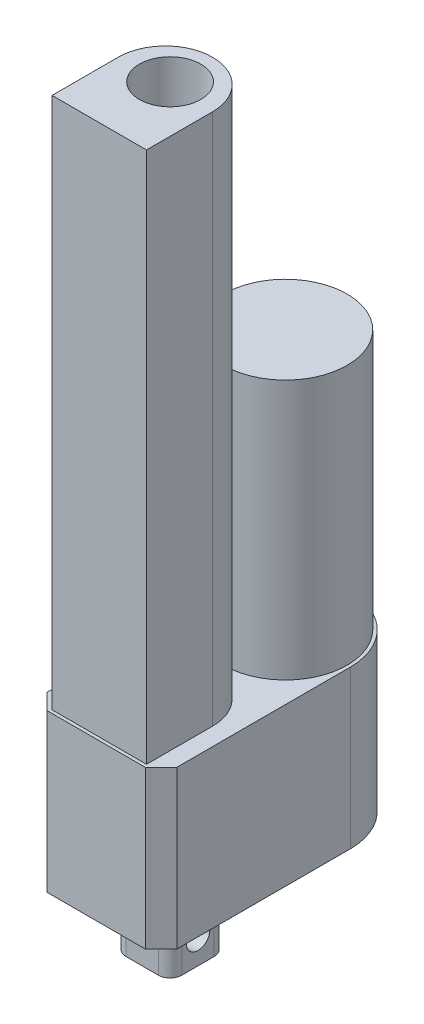
ISO-10303-21;
HEADER;
FILE_DESCRIPTION(('STEP AP214'),'2;1');
FILE_NAME('part.step','',(''),(''),'','','');
FILE_SCHEMA(('AUTOMOTIVE_DESIGN { 1 0 10303 214 1 1 1 1 }'));
ENDSEC;
DATA;
#1=APPLICATION_CONTEXT('core data for automotive mechanical design processes');
#2=APPLICATION_PROTOCOL_DEFINITION('international standard','automotive_design',2000,#1);
#3=PRODUCT_CONTEXT('',#1,'mechanical');
#4=PRODUCT('Part','Part','',(#3));
#5=PRODUCT_RELATED_PRODUCT_CATEGORY('part','',(#4));
#6=PRODUCT_DEFINITION_FORMATION('','',#4);
#7=PRODUCT_DEFINITION_CONTEXT('part definition',#1,'design');
#8=PRODUCT_DEFINITION('design','',#6,#7);
#9=PRODUCT_DEFINITION_SHAPE('','',#8);
#10=(LENGTH_UNIT() NAMED_UNIT(*) SI_UNIT(.MILLI.,.METRE.));
#11=(NAMED_UNIT(*) PLANE_ANGLE_UNIT() SI_UNIT($,.RADIAN.));
#12=(NAMED_UNIT(*) SI_UNIT($,.STERADIAN.) SOLID_ANGLE_UNIT());
#13=UNCERTAINTY_MEASURE_WITH_UNIT(LENGTH_MEASURE(1.E-05),#10,'distance_accuracy_value','');
#14=(GEOMETRIC_REPRESENTATION_CONTEXT(3) GLOBAL_UNCERTAINTY_ASSIGNED_CONTEXT((#13)) GLOBAL_UNIT_ASSIGNED_CONTEXT((#10,
#11,#12)) REPRESENTATION_CONTEXT('',''));
#15=CARTESIAN_POINT('',(0.,0.,0.));
#16=DIRECTION('',(0.,0.,1.));
#17=DIRECTION('',(1.,0.,0.));
#18=AXIS2_PLACEMENT_3D('',#15,#16,#17);
#19=CARTESIAN_POINT('',(-29.9066354603378,0.,-28.37671645601));
#20=DIRECTION('',(0.,1.,0.));
#21=DIRECTION('',(0.,0.,1.));
#22=AXIS2_PLACEMENT_3D('',#19,#20,#21);
#23=PLANE('',#22);
#24=CARTESIAN_POINT('',(-29.9066354603378,0.,-28.37671645601));
#25=DIRECTION('',(0.,1.,0.));
#26=DIRECTION('',(0.,0.,1.));
#27=AXIS2_PLACEMENT_3D('',#24,#25,#26);
#28=CIRCLE('',#27,20.9296);
#29=CARTESIAN_POINT('',(-29.9066354603376,0.,-49.30631645601));
#30=VERTEX_POINT('',#29);
#31=CARTESIAN_POINT('',(-50.8362354603378,0.,-28.3767164560098));
#32=VERTEX_POINT('',#31);
#33=EDGE_CURVE('E228',#30,#32,#28,.T.);
#34=ORIENTED_EDGE('',*,*,#33,.F.);
#35=DIRECTION('',(-1.,0.,0.));
#36=VECTOR('',#35,1.);
#37=CARTESIAN_POINT('',(-29.9066354603376,0.,-49.30631645601));
#38=LINE('',#37,#36);
#39=CARTESIAN_POINT('',(-29.8558354603379,0.,-49.30631645601));
#40=VERTEX_POINT('',#39);
#41=EDGE_CURVE('E235',#40,#30,#38,.T.);
#42=ORIENTED_EDGE('',*,*,#41,.F.);
#43=CARTESIAN_POINT('',(-29.8558354603378,0.,-28.37671645601));
#44=DIRECTION('',(0.,1.,0.));
#45=DIRECTION('',(0.,0.,-1.));
#46=AXIS2_PLACEMENT_3D('',#43,#44,#45);
#47=CIRCLE('',#46,20.9296);
#48=CARTESIAN_POINT('',(-8.92623546033779,0.,-28.3767164560098));
#49=VERTEX_POINT('',#48);
#50=EDGE_CURVE('E262',#49,#40,#47,.T.);
#51=ORIENTED_EDGE('',*,*,#50,.F.);
#52=DIRECTION('',(0.,0.,-1.));
#53=VECTOR('',#52,1.);
#54=CARTESIAN_POINT('',(-8.92623546033779,0.,-28.3767164560098));
#55=LINE('',#54,#53);
#56=CARTESIAN_POINT('',(-8.92623546033777,0.,27.65568354399));
#57=VERTEX_POINT('',#56);
#58=EDGE_CURVE('E260',#57,#49,#55,.T.);
#59=ORIENTED_EDGE('',*,*,#58,.F.);
#60=DIRECTION('',(0.707106781186549,0.,-0.707106781186546));
#61=VECTOR('',#60,1.);
#62=CARTESIAN_POINT('',(-14.0062354603378,0.,32.73568354399));
#63=LINE('',#62,#61);
#64=CARTESIAN_POINT('',(-14.0062354603378,0.,32.73568354399));
#65=VERTEX_POINT('',#64);
#66=EDGE_CURVE('E258',#65,#57,#63,.T.);
#67=ORIENTED_EDGE('',*,*,#66,.F.);
#68=DIRECTION('',(1.,0.,0.));
#69=VECTOR('',#68,1.);
#70=CARTESIAN_POINT('',(-45.7562354603378,0.,32.73568354399));
#71=LINE('',#70,#69);
#72=CARTESIAN_POINT('',(-45.7562354603378,0.,32.73568354399));
#73=VERTEX_POINT('',#72);
#74=EDGE_CURVE('E256',#73,#65,#71,.T.);
#75=ORIENTED_EDGE('',*,*,#74,.F.);
#76=DIRECTION('',(0.707106781186546,0.,0.707106781186548));
#77=VECTOR('',#76,1.);
#78=CARTESIAN_POINT('',(-50.8362354603378,0.,27.65568354399));
#79=LINE('',#78,#77);
#80=CARTESIAN_POINT('',(-50.8362354603378,0.,27.65568354399));
#81=VERTEX_POINT('',#80);
#82=EDGE_CURVE('E254',#81,#73,#79,.T.);
#83=ORIENTED_EDGE('',*,*,#82,.F.);
#84=DIRECTION('',(0.,0.,1.));
#85=VECTOR('',#84,1.);
#86=CARTESIAN_POINT('',(-50.8362354603378,0.,-28.3767164560098));
#87=LINE('',#86,#85);
#88=EDGE_CURVE('E252',#32,#81,#87,.T.);
#89=ORIENTED_EDGE('',*,*,#88,.F.);
#90=EDGE_LOOP('',(#34,#42,#51,#59,#67,#75,#83,#89));
#91=FACE_BOUND('',#90,.T.);
#92=CARTESIAN_POINT('',(-35.0882354603378,0.,3.65268354399004));
#93=DIRECTION('',(0.,-1.,0.));
#94=DIRECTION('',(0.,0.,1.));
#95=AXIS2_PLACEMENT_3D('',#92,#93,#94);
#96=CIRCLE('',#95,3.81);
#97=CARTESIAN_POINT('',(-38.8982354603378,0.,3.65268354399004));
#98=VERTEX_POINT('',#97);
#99=CARTESIAN_POINT('',(-35.0882354603378,0.,-0.157316456009964));
#100=VERTEX_POINT('',#99);
#101=EDGE_CURVE('E189',#98,#100,#96,.T.);
#102=ORIENTED_EDGE('',*,*,#101,.F.);
#103=DIRECTION('',(0.,0.,-1.));
#104=VECTOR('',#103,1.);
#105=CARTESIAN_POINT('',(-38.8982354603378,0.,3.65268354399004));
#106=LINE('',#105,#104);
#107=CARTESIAN_POINT('',(-38.8982354603378,0.,14.06668354399));
#108=VERTEX_POINT('',#107);
#109=EDGE_CURVE('E186',#108,#98,#106,.T.);
#110=ORIENTED_EDGE('',*,*,#109,.F.);
#111=CARTESIAN_POINT('',(-35.0882354603378,0.,14.06668354399));
#112=DIRECTION('',(0.,-1.,0.));
#113=DIRECTION('',(0.,0.,-1.));
#114=AXIS2_PLACEMENT_3D('',#111,#112,#113);
#115=CIRCLE('',#114,3.80999999999999);
#116=CARTESIAN_POINT('',(-35.0882354603378,0.,17.87668354399));
#117=VERTEX_POINT('',#116);
#118=EDGE_CURVE('E455',#117,#108,#115,.T.);
#119=ORIENTED_EDGE('',*,*,#118,.F.);
#120=DIRECTION('',(-1.,0.,0.));
#121=VECTOR('',#120,1.);
#122=CARTESIAN_POINT('',(-24.6742354603378,0.,17.87668354399));
#123=LINE('',#122,#121);
#124=CARTESIAN_POINT('',(-24.6742354603378,0.,17.87668354399));
#125=VERTEX_POINT('',#124);
#126=EDGE_CURVE('E452',#125,#117,#123,.T.);
#127=ORIENTED_EDGE('',*,*,#126,.F.);
#128=CARTESIAN_POINT('',(-24.6742354603378,0.,14.06668354399));
#129=DIRECTION('',(0.,-1.,0.));
#130=DIRECTION('',(0.,0.,-1.));
#131=AXIS2_PLACEMENT_3D('',#128,#129,#130);
#132=CIRCLE('',#131,3.81);
#133=CARTESIAN_POINT('',(-20.8642354603378,0.,14.06668354399));
#134=VERTEX_POINT('',#133);
#135=EDGE_CURVE('E449',#134,#125,#132,.T.);
#136=ORIENTED_EDGE('',*,*,#135,.F.);
#137=DIRECTION('',(0.,0.,1.));
#138=VECTOR('',#137,1.);
#139=CARTESIAN_POINT('',(-20.8642354603378,0.,3.65268354399004));
#140=LINE('',#139,#138);
#141=CARTESIAN_POINT('',(-20.8642354603378,0.,3.65268354399004));
#142=VERTEX_POINT('',#141);
#143=EDGE_CURVE('E446',#142,#134,#140,.T.);
#144=ORIENTED_EDGE('',*,*,#143,.F.);
#145=CARTESIAN_POINT('',(-24.6742354603378,0.,3.65268354399004));
#146=DIRECTION('',(0.,-1.,0.));
#147=DIRECTION('',(0.,0.,-1.));
#148=AXIS2_PLACEMENT_3D('',#145,#146,#147);
#149=CIRCLE('',#148,3.81);
#150=CARTESIAN_POINT('',(-24.6742354603378,0.,-0.157316456009966));
#151=VERTEX_POINT('',#150);
#152=EDGE_CURVE('E52',#151,#142,#149,.T.);
#153=ORIENTED_EDGE('',*,*,#152,.F.);
#154=DIRECTION('',(1.,0.,0.));
#155=VECTOR('',#154,1.);
#156=CARTESIAN_POINT('',(-24.6742354603378,0.,-0.157316456009964));
#157=LINE('',#156,#155);
#158=EDGE_CURVE('E47',#100,#151,#157,.T.);
#159=ORIENTED_EDGE('',*,*,#158,.F.);
#160=EDGE_LOOP('',(#102,#110,#119,#127,#136,#144,#153,#159));
#161=FACE_BOUND('',#160,.T.);
#162=ADVANCED_FACE('F32',(#91,#161),#23,.F.);
#163=CARTESIAN_POINT('',(-29.9066354603378,50.8,-28.37671645601));
#164=DIRECTION('',(0.,1.,0.));
#165=DIRECTION('',(0.,0.,1.));
#166=AXIS2_PLACEMENT_3D('',#163,#164,#165);
#167=PLANE('',#166);
#168=CARTESIAN_POINT('',(-29.8812354603378,50.8,-28.35131645601));
#169=DIRECTION('',(0.,1.,0.));
#170=DIRECTION('',(0.,0.,1.));
#171=AXIS2_PLACEMENT_3D('',#168,#169,#170);
#172=CIRCLE('',#171,19.939);
#173=CARTESIAN_POINT('',(-29.8812354603378,50.8,-8.41231645600997));
#174=VERTEX_POINT('',#173);
#175=EDGE_CURVE('E224',#174,#174,#172,.T.);
#176=ORIENTED_EDGE('',*,*,#175,.F.);
#177=EDGE_LOOP('',(#176));
#178=FACE_BOUND('',#177,.T.);
#179=CARTESIAN_POINT('',(-29.9066354603378,50.8,-28.37671645601));
#180=DIRECTION('',(0.,1.,0.));
#181=DIRECTION('',(0.,0.,1.));
#182=AXIS2_PLACEMENT_3D('',#179,#180,#181);
#183=CIRCLE('',#182,20.9296);
#184=CARTESIAN_POINT('',(-29.9066354603376,50.8,-49.30631645601));
#185=VERTEX_POINT('',#184);
#186=CARTESIAN_POINT('',(-50.8362354603378,50.8,-28.3767164560098));
#187=VERTEX_POINT('',#186);
#188=EDGE_CURVE('E231',#185,#187,#183,.T.);
#189=ORIENTED_EDGE('',*,*,#188,.T.);
#190=DIRECTION('',(0.,0.,1.));
#191=VECTOR('',#190,1.);
#192=CARTESIAN_POINT('',(-50.8362354603378,50.8,-28.3767164560098));
#193=LINE('',#192,#191);
#194=CARTESIAN_POINT('',(-50.8362354603378,50.8,27.65568354399));
#195=VERTEX_POINT('',#194);
#196=EDGE_CURVE('E234',#187,#195,#193,.T.);
#197=ORIENTED_EDGE('',*,*,#196,.T.);
#198=DIRECTION('',(0.707106781186546,0.,0.707106781186548));
#199=VECTOR('',#198,1.);
#200=CARTESIAN_POINT('',(-50.8362354603378,50.8,27.65568354399));
#201=LINE('',#200,#199);
#202=CARTESIAN_POINT('',(-45.7562354603378,50.8,32.73568354399));
#203=VERTEX_POINT('',#202);
#204=EDGE_CURVE('E237',#195,#203,#201,.T.);
#205=ORIENTED_EDGE('',*,*,#204,.T.);
#206=DIRECTION('',(1.,0.,0.));
#207=VECTOR('',#206,1.);
#208=CARTESIAN_POINT('',(-45.7562354603378,50.8,32.73568354399));
#209=LINE('',#208,#207);
#210=CARTESIAN_POINT('',(-14.0062354603378,50.8,32.73568354399));
#211=VERTEX_POINT('',#210);
#212=EDGE_CURVE('E239',#203,#211,#209,.T.);
#213=ORIENTED_EDGE('',*,*,#212,.T.);
#214=DIRECTION('',(0.707106781186549,0.,-0.707106781186546));
#215=VECTOR('',#214,1.);
#216=CARTESIAN_POINT('',(-14.0062354603378,50.8,32.73568354399));
#217=LINE('',#216,#215);
#218=CARTESIAN_POINT('',(-8.92623546033777,50.8,27.65568354399));
#219=VERTEX_POINT('',#218);
#220=EDGE_CURVE('E241',#211,#219,#217,.T.);
#221=ORIENTED_EDGE('',*,*,#220,.T.);
#222=DIRECTION('',(0.,0.,-1.));
#223=VECTOR('',#222,1.);
#224=CARTESIAN_POINT('',(-8.92623546033779,50.8,-28.3767164560098));
#225=LINE('',#224,#223);
#226=CARTESIAN_POINT('',(-8.92623546033779,50.8,-28.3767164560098));
#227=VERTEX_POINT('',#226);
#228=EDGE_CURVE('E243',#219,#227,#225,.T.);
#229=ORIENTED_EDGE('',*,*,#228,.T.);
#230=CARTESIAN_POINT('',(-29.8558354603378,50.8,-28.37671645601));
#231=DIRECTION('',(0.,1.,0.));
#232=DIRECTION('',(0.,0.,-1.));
#233=AXIS2_PLACEMENT_3D('',#230,#231,#232);
#234=CIRCLE('',#233,20.9296);
#235=CARTESIAN_POINT('',(-29.8558354603379,50.8,-49.30631645601));
#236=VERTEX_POINT('',#235);
#237=EDGE_CURVE('E245',#227,#236,#234,.T.);
#238=ORIENTED_EDGE('',*,*,#237,.T.);
#239=DIRECTION('',(-1.,0.,0.));
#240=VECTOR('',#239,1.);
#241=CARTESIAN_POINT('',(-29.9066354603376,50.8,-49.30631645601));
#242=LINE('',#241,#240);
#243=EDGE_CURVE('E247',#236,#185,#242,.T.);
#244=ORIENTED_EDGE('',*,*,#243,.T.);
#245=EDGE_LOOP('',(#189,#197,#205,#213,#221,#229,#238,#244));
#246=FACE_BOUND('',#245,.T.);
#247=DIRECTION('',(1.,0.,0.));
#248=VECTOR('',#247,1.);
#249=CARTESIAN_POINT('',(-45.1212354603378,50.8,31.7078528889851));
#250=LINE('',#249,#248);
#251=CARTESIAN_POINT('',(-45.1212354603378,50.8,31.7078528889851));
#252=VERTEX_POINT('',#251);
#253=CARTESIAN_POINT('',(-14.6412354603378,50.8,31.7078528889852));
#254=VERTEX_POINT('',#253);
#255=EDGE_CURVE('E193',#252,#254,#250,.T.);
#256=ORIENTED_EDGE('',*,*,#255,.F.);
#257=DIRECTION('',(0.,0.,1.));
#258=VECTOR('',#257,1.);
#259=CARTESIAN_POINT('',(-45.1212354603378,50.8,31.7078528889851));
#260=LINE('',#259,#258);
#261=CARTESIAN_POINT('',(-45.1212354603378,50.8,10.3718528889852));
#262=VERTEX_POINT('',#261);
#263=EDGE_CURVE('E190',#262,#252,#260,.T.);
#264=ORIENTED_EDGE('',*,*,#263,.F.);
#265=CARTESIAN_POINT('',(-29.8812354603378,50.8,10.3718528889851));
#266=DIRECTION('',(0.,1.,0.));
#267=DIRECTION('',(0.,0.,-1.));
#268=AXIS2_PLACEMENT_3D('',#265,#266,#267);
#269=CIRCLE('',#268,15.24);
#270=CARTESIAN_POINT('',(-14.6412354603378,50.8,10.3718528889851));
#271=VERTEX_POINT('',#270);
#272=EDGE_CURVE('E203',#271,#262,#269,.T.);
#273=ORIENTED_EDGE('',*,*,#272,.F.);
#274=DIRECTION('',(0.,0.,-1.));
#275=VECTOR('',#274,1.);
#276=CARTESIAN_POINT('',(-14.6412354603378,50.8,31.7078528889852));
#277=LINE('',#276,#275);
#278=EDGE_CURVE('E211',#254,#271,#277,.T.);
#279=ORIENTED_EDGE('',*,*,#278,.F.);
#280=EDGE_LOOP('',(#256,#264,#273,#279));
#281=FACE_BOUND('',#280,.T.);
#282=ADVANCED_FACE('F304',(#178,#246,#281),#167,.T.);
#283=CARTESIAN_POINT('',(-29.9066354603378,50.8,-28.37671645601));
#284=DIRECTION('',(0.,-1.,0.));
#285=DIRECTION('',(0.,0.,-1.));
#286=AXIS2_PLACEMENT_3D('',#283,#284,#285);
#287=CYLINDRICAL_SURFACE('',#286,20.9296);
#288=ORIENTED_EDGE('',*,*,#33,.T.);
#289=DIRECTION('',(0.,-1.,0.));
#290=VECTOR('',#289,1.);
#291=CARTESIAN_POINT('',(-50.8362354603378,50.8,-28.3767164560098));
#292=LINE('',#291,#290);
#293=EDGE_CURVE('E11',#187,#32,#292,.T.);
#294=ORIENTED_EDGE('',*,*,#293,.F.);
#295=ORIENTED_EDGE('',*,*,#188,.F.);
#296=DIRECTION('',(0.,-1.,0.));
#297=VECTOR('',#296,1.);
#298=CARTESIAN_POINT('',(-29.9066354603376,50.8,-49.30631645601));
#299=LINE('',#298,#297);
#300=EDGE_CURVE('E249',#185,#30,#299,.T.);
#301=ORIENTED_EDGE('',*,*,#300,.T.);
#302=EDGE_LOOP('',(#288,#294,#295,#301));
#303=FACE_BOUND('',#302,.T.);
#304=ADVANCED_FACE('F34',(#303),#287,.T.);
#305=CARTESIAN_POINT('',(-50.8362354603378,50.8,-28.3767164560098));
#306=DIRECTION('',(1.,0.,0.));
#307=DIRECTION('',(0.,0.,-1.));
#308=AXIS2_PLACEMENT_3D('',#305,#306,#307);
#309=PLANE('',#308);
#310=ORIENTED_EDGE('',*,*,#88,.T.);
#311=DIRECTION('',(0.,-1.,0.));
#312=VECTOR('',#311,1.);
#313=CARTESIAN_POINT('',(-50.8362354603378,50.8,27.65568354399));
#314=LINE('',#313,#312);
#315=EDGE_CURVE('E40',#195,#81,#314,.T.);
#316=ORIENTED_EDGE('',*,*,#315,.F.);
#317=ORIENTED_EDGE('',*,*,#196,.F.);
#318=ORIENTED_EDGE('',*,*,#293,.T.);
#319=EDGE_LOOP('',(#310,#316,#317,#318));
#320=FACE_BOUND('',#319,.T.);
#321=ADVANCED_FACE('F309',(#320),#309,.F.);
#322=CARTESIAN_POINT('',(-50.8362354603378,50.8,27.65568354399));
#323=DIRECTION('',(0.707106781186548,0.,-0.707106781186546));
#324=DIRECTION('',(-0.707106781186547,0.,-0.707106781186549));
#325=AXIS2_PLACEMENT_3D('',#322,#323,#324);
#326=PLANE('',#325);
#327=ORIENTED_EDGE('',*,*,#82,.T.);
#328=DIRECTION('',(0.,-1.,0.));
#329=VECTOR('',#328,1.);
#330=CARTESIAN_POINT('',(-45.7562354603378,50.8,32.73568354399));
#331=LINE('',#330,#329);
#332=EDGE_CURVE('E279',#203,#73,#331,.T.);
#333=ORIENTED_EDGE('',*,*,#332,.F.);
#334=ORIENTED_EDGE('',*,*,#204,.F.);
#335=ORIENTED_EDGE('',*,*,#315,.T.);
#336=EDGE_LOOP('',(#327,#333,#334,#335));
#337=FACE_BOUND('',#336,.T.);
#338=ADVANCED_FACE('F286',(#337),#326,.F.);
#339=CARTESIAN_POINT('',(-45.7562354603378,50.8,32.73568354399));
#340=DIRECTION('',(0.,0.,-1.));
#341=DIRECTION('',(-1.,0.,0.));
#342=AXIS2_PLACEMENT_3D('',#339,#340,#341);
#343=PLANE('',#342);
#344=ORIENTED_EDGE('',*,*,#74,.T.);
#345=DIRECTION('',(0.,-1.,0.));
#346=VECTOR('',#345,1.);
#347=CARTESIAN_POINT('',(-14.0062354603378,50.8,32.73568354399));
#348=LINE('',#347,#346);
#349=EDGE_CURVE('E276',#211,#65,#348,.T.);
#350=ORIENTED_EDGE('',*,*,#349,.F.);
#351=ORIENTED_EDGE('',*,*,#212,.F.);
#352=ORIENTED_EDGE('',*,*,#332,.T.);
#353=EDGE_LOOP('',(#344,#350,#351,#352));
#354=FACE_BOUND('',#353,.T.);
#355=ADVANCED_FACE('F296',(#354),#343,.F.);
#356=CARTESIAN_POINT('',(-14.0062354603378,50.8,32.73568354399));
#357=DIRECTION('',(-0.707106781186546,0.,-0.707106781186549));
#358=DIRECTION('',(-0.707106781186549,0.,0.707106781186546));
#359=AXIS2_PLACEMENT_3D('',#356,#357,#358);
#360=PLANE('',#359);
#361=ORIENTED_EDGE('',*,*,#66,.T.);
#362=DIRECTION('',(0.,-1.,0.));
#363=VECTOR('',#362,1.);
#364=CARTESIAN_POINT('',(-8.92623546033777,50.8,27.65568354399));
#365=LINE('',#364,#363);
#366=EDGE_CURVE('E273',#219,#57,#365,.T.);
#367=ORIENTED_EDGE('',*,*,#366,.F.);
#368=ORIENTED_EDGE('',*,*,#220,.F.);
#369=ORIENTED_EDGE('',*,*,#349,.T.);
#370=EDGE_LOOP('',(#361,#367,#368,#369));
#371=FACE_BOUND('',#370,.T.);
#372=ADVANCED_FACE('F300',(#371),#360,.F.);
#373=CARTESIAN_POINT('',(-8.92623546033779,50.8,-28.3767164560098));
#374=DIRECTION('',(-1.,0.,0.));
#375=DIRECTION('',(0.,0.,1.));
#376=AXIS2_PLACEMENT_3D('',#373,#374,#375);
#377=PLANE('',#376);
#378=ORIENTED_EDGE('',*,*,#58,.T.);
#379=DIRECTION('',(0.,-1.,0.));
#380=VECTOR('',#379,1.);
#381=CARTESIAN_POINT('',(-8.92623546033779,50.8,-28.3767164560098));
#382=LINE('',#381,#380);
#383=EDGE_CURVE('E270',#227,#49,#382,.T.);
#384=ORIENTED_EDGE('',*,*,#383,.F.);
#385=ORIENTED_EDGE('',*,*,#228,.F.);
#386=ORIENTED_EDGE('',*,*,#366,.T.);
#387=EDGE_LOOP('',(#378,#384,#385,#386));
#388=FACE_BOUND('',#387,.T.);
#389=ADVANCED_FACE('F322',(#388),#377,.F.);
#390=CARTESIAN_POINT('',(-29.8558354603378,50.8,-28.37671645601));
#391=DIRECTION('',(0.,-1.,0.));
#392=DIRECTION('',(0.,0.,-1.));
#393=AXIS2_PLACEMENT_3D('',#390,#391,#392);
#394=CYLINDRICAL_SURFACE('',#393,20.9296);
#395=ORIENTED_EDGE('',*,*,#50,.T.);
#396=DIRECTION('',(0.,-1.,0.));
#397=VECTOR('',#396,1.);
#398=CARTESIAN_POINT('',(-29.8558354603379,50.8,-49.30631645601));
#399=LINE('',#398,#397);
#400=EDGE_CURVE('E267',#236,#40,#399,.T.);
#401=ORIENTED_EDGE('',*,*,#400,.F.);
#402=ORIENTED_EDGE('',*,*,#237,.F.);
#403=ORIENTED_EDGE('',*,*,#383,.T.);
#404=EDGE_LOOP('',(#395,#401,#402,#403));
#405=FACE_BOUND('',#404,.T.);
#406=ADVANCED_FACE('F320',(#405),#394,.T.);
#407=CARTESIAN_POINT('',(-29.9066354603376,50.8,-49.30631645601));
#408=DIRECTION('',(0.,0.,1.));
#409=DIRECTION('',(1.,0.,0.));
#410=AXIS2_PLACEMENT_3D('',#407,#408,#409);
#411=PLANE('',#410);
#412=ORIENTED_EDGE('',*,*,#41,.T.);
#413=ORIENTED_EDGE('',*,*,#300,.F.);
#414=ORIENTED_EDGE('',*,*,#243,.F.);
#415=ORIENTED_EDGE('',*,*,#400,.T.);
#416=EDGE_LOOP('',(#412,#413,#414,#415));
#417=FACE_BOUND('',#416,.T.);
#418=ADVANCED_FACE('F315',(#417),#411,.F.);
#419=CARTESIAN_POINT('',(-29.8812354603378,134.62,-28.35131645601));
#420=DIRECTION('',(0.,-1.,0.));
#421=DIRECTION('',(0.,0.,-1.));
#422=AXIS2_PLACEMENT_3D('',#419,#420,#421);
#423=CYLINDRICAL_SURFACE('',#422,19.939);
#424=CARTESIAN_POINT('',(-29.8812354603378,134.62,-28.35131645601));
#425=DIRECTION('',(0.,1.,0.));
#426=DIRECTION('',(0.,0.,1.));
#427=AXIS2_PLACEMENT_3D('',#424,#425,#426);
#428=CIRCLE('',#427,19.939);
#429=CARTESIAN_POINT('',(-29.8812354603378,134.62,-8.41231645600997));
#430=VERTEX_POINT('',#429);
#431=EDGE_CURVE('E225',#430,#430,#428,.T.);
#432=ORIENTED_EDGE('',*,*,#431,.F.);
#433=EDGE_LOOP('',(#432));
#434=FACE_BOUND('',#433,.T.);
#435=ORIENTED_EDGE('',*,*,#175,.T.);
#436=EDGE_LOOP('',(#435));
#437=FACE_BOUND('',#436,.T.);
#438=ADVANCED_FACE('F341',(#434,#437),#423,.T.);
#439=CARTESIAN_POINT('',(-29.8812354603378,134.62,-28.35131645601));
#440=DIRECTION('',(0.,1.,0.));
#441=DIRECTION('',(0.,0.,1.));
#442=AXIS2_PLACEMENT_3D('',#439,#440,#441);
#443=PLANE('',#442);
#444=ORIENTED_EDGE('',*,*,#431,.T.);
#445=EDGE_LOOP('',(#444));
#446=FACE_BOUND('',#445,.T.);
#447=ADVANCED_FACE('F345',(#446),#443,.T.);
#448=CARTESIAN_POINT('',(-45.1212354603378,222.504,31.7078528889851));
#449=DIRECTION('',(1.,0.,0.));
#450=DIRECTION('',(0.,0.,-1.));
#451=AXIS2_PLACEMENT_3D('',#448,#449,#450);
#452=PLANE('',#451);
#453=ORIENTED_EDGE('',*,*,#263,.T.);
#454=DIRECTION('',(0.,-1.,0.));
#455=VECTOR('',#454,1.);
#456=CARTESIAN_POINT('',(-45.1212354603378,222.504,31.7078528889851));
#457=LINE('',#456,#455);
#458=CARTESIAN_POINT('',(-45.1212354603378,222.504,31.7078528889851));
#459=VERTEX_POINT('',#458);
#460=EDGE_CURVE('E222',#459,#252,#457,.T.);
#461=ORIENTED_EDGE('',*,*,#460,.F.);
#462=DIRECTION('',(0.,0.,1.));
#463=VECTOR('',#462,1.);
#464=CARTESIAN_POINT('',(-45.1212354603378,222.504,31.7078528889851));
#465=LINE('',#464,#463);
#466=CARTESIAN_POINT('',(-45.1212354603378,222.504,10.3718528889852));
#467=VERTEX_POINT('',#466);
#468=EDGE_CURVE('E199',#467,#459,#465,.T.);
#469=ORIENTED_EDGE('',*,*,#468,.F.);
#470=DIRECTION('',(0.,-1.,0.));
#471=VECTOR('',#470,1.);
#472=CARTESIAN_POINT('',(-45.1212354603378,222.504,10.3718528889852));
#473=LINE('',#472,#471);
#474=EDGE_CURVE('E208',#467,#262,#473,.T.);
#475=ORIENTED_EDGE('',*,*,#474,.T.);
#476=EDGE_LOOP('',(#453,#461,#469,#475));
#477=FACE_BOUND('',#476,.T.);
#478=ADVANCED_FACE('F350',(#477),#452,.F.);
#479=CARTESIAN_POINT('',(-45.1212354603378,222.504,31.7078528889851));
#480=DIRECTION('',(0.,0.,-1.));
#481=DIRECTION('',(-1.,0.,0.));
#482=AXIS2_PLACEMENT_3D('',#479,#480,#481);
#483=PLANE('',#482);
#484=ORIENTED_EDGE('',*,*,#255,.T.);
#485=DIRECTION('',(0.,-1.,0.));
#486=VECTOR('',#485,1.);
#487=CARTESIAN_POINT('',(-14.6412354603378,222.504,31.7078528889852));
#488=LINE('',#487,#486);
#489=CARTESIAN_POINT('',(-14.6412354603378,222.504,31.7078528889852));
#490=VERTEX_POINT('',#489);
#491=EDGE_CURVE('E219',#490,#254,#488,.T.);
#492=ORIENTED_EDGE('',*,*,#491,.F.);
#493=DIRECTION('',(1.,0.,0.));
#494=VECTOR('',#493,1.);
#495=CARTESIAN_POINT('',(-45.1212354603378,222.504,31.7078528889851));
#496=LINE('',#495,#494);
#497=EDGE_CURVE('E202',#459,#490,#496,.T.);
#498=ORIENTED_EDGE('',*,*,#497,.F.);
#499=ORIENTED_EDGE('',*,*,#460,.T.);
#500=EDGE_LOOP('',(#484,#492,#498,#499));
#501=FACE_BOUND('',#500,.T.);
#502=ADVANCED_FACE('F358',(#501),#483,.F.);
#503=CARTESIAN_POINT('',(-14.6412354603378,222.504,31.7078528889852));
#504=DIRECTION('',(-1.,0.,0.));
#505=DIRECTION('',(0.,0.,1.));
#506=AXIS2_PLACEMENT_3D('',#503,#504,#505);
#507=PLANE('',#506);
#508=ORIENTED_EDGE('',*,*,#278,.T.);
#509=DIRECTION('',(0.,-1.,0.));
#510=VECTOR('',#509,1.);
#511=CARTESIAN_POINT('',(-14.6412354603378,222.504,10.3718528889851));
#512=LINE('',#511,#510);
#513=CARTESIAN_POINT('',(-14.6412354603378,222.504,10.3718528889851));
#514=VERTEX_POINT('',#513);
#515=EDGE_CURVE('E217',#514,#271,#512,.T.);
#516=ORIENTED_EDGE('',*,*,#515,.F.);
#517=DIRECTION('',(0.,0.,-1.));
#518=VECTOR('',#517,1.);
#519=CARTESIAN_POINT('',(-14.6412354603378,222.504,31.7078528889852));
#520=LINE('',#519,#518);
#521=EDGE_CURVE('E205',#490,#514,#520,.T.);
#522=ORIENTED_EDGE('',*,*,#521,.F.);
#523=ORIENTED_EDGE('',*,*,#491,.T.);
#524=EDGE_LOOP('',(#508,#516,#522,#523));
#525=FACE_BOUND('',#524,.T.);
#526=ADVANCED_FACE('F362',(#525),#507,.F.);
#527=CARTESIAN_POINT('',(-29.8812354603378,222.504,10.3718528889851));
#528=DIRECTION('',(0.,-1.,0.));
#529=DIRECTION('',(0.,0.,-1.));
#530=AXIS2_PLACEMENT_3D('',#527,#528,#529);
#531=CYLINDRICAL_SURFACE('',#530,15.24);
#532=ORIENTED_EDGE('',*,*,#272,.T.);
#533=ORIENTED_EDGE('',*,*,#474,.F.);
#534=CARTESIAN_POINT('',(-29.8812354603378,222.504,10.3718528889851));
#535=DIRECTION('',(0.,1.,0.));
#536=DIRECTION('',(0.,0.,-1.));
#537=AXIS2_PLACEMENT_3D('',#534,#535,#536);
#538=CIRCLE('',#537,15.24);
#539=EDGE_CURVE('E207',#514,#467,#538,.T.);
#540=ORIENTED_EDGE('',*,*,#539,.F.);
#541=ORIENTED_EDGE('',*,*,#515,.T.);
#542=EDGE_LOOP('',(#532,#533,#540,#541));
#543=FACE_BOUND('',#542,.T.);
#544=ADVANCED_FACE('F366',(#543),#531,.T.);
#545=CARTESIAN_POINT('',(-29.8812354603378,222.504,10.3718528889851));
#546=DIRECTION('',(0.,-1.,0.));
#547=DIRECTION('',(0.,0.,-1.));
#548=AXIS2_PLACEMENT_3D('',#545,#546,#547);
#549=PLANE('',#548);
#550=CARTESIAN_POINT('',(-29.8812354603378,222.504,8.85968354399003));
#551=DIRECTION('',(0.,1.,0.));
#552=DIRECTION('',(0.,0.,1.));
#553=AXIS2_PLACEMENT_3D('',#550,#551,#552);
#554=CIRCLE('',#553,9.906);
#555=CARTESIAN_POINT('',(-29.8812354603378,222.504,18.76568354399));
#556=VERTEX_POINT('',#555);
#557=EDGE_CURVE('E422',#556,#556,#554,.T.);
#558=ORIENTED_EDGE('',*,*,#557,.F.);
#559=EDGE_LOOP('',(#558));
#560=FACE_BOUND('',#559,.T.);
#561=ORIENTED_EDGE('',*,*,#468,.T.);
#562=ORIENTED_EDGE('',*,*,#497,.T.);
#563=ORIENTED_EDGE('',*,*,#521,.T.);
#564=ORIENTED_EDGE('',*,*,#539,.T.);
#565=EDGE_LOOP('',(#561,#562,#563,#564));
#566=FACE_BOUND('',#565,.T.);
#567=ADVANCED_FACE('F370',(#560,#566),#549,.F.);
#568=CARTESIAN_POINT('',(-35.0882354603378,-20.066,3.65268354399004));
#569=DIRECTION('',(0.,1.,0.));
#570=DIRECTION('',(0.,0.,1.));
#571=AXIS2_PLACEMENT_3D('',#568,#569,#570);
#572=CYLINDRICAL_SURFACE('',#571,3.81);
#573=ORIENTED_EDGE('',*,*,#101,.T.);
#574=DIRECTION('',(0.,1.,0.));
#575=VECTOR('',#574,1.);
#576=CARTESIAN_POINT('',(-35.0882354603378,-20.066,-0.157316456009964));
#577=LINE('',#576,#575);
#578=CARTESIAN_POINT('',(-35.0882354603378,-20.066,-0.157316456009964));
#579=VERTEX_POINT('',#578);
#580=EDGE_CURVE('E170',#579,#100,#577,.T.);
#581=ORIENTED_EDGE('',*,*,#580,.F.);
#582=CARTESIAN_POINT('',(-35.0882354603378,-20.066,3.65268354399004));
#583=DIRECTION('',(0.,-1.,0.));
#584=DIRECTION('',(0.,0.,1.));
#585=AXIS2_PLACEMENT_3D('',#582,#583,#584);
#586=CIRCLE('',#585,3.81);
#587=CARTESIAN_POINT('',(-38.8982354603378,-20.066,3.65268354399004));
#588=VERTEX_POINT('',#587);
#589=EDGE_CURVE('E177',#588,#579,#586,.T.);
#590=ORIENTED_EDGE('',*,*,#589,.F.);
#591=DIRECTION('',(0.,1.,0.));
#592=VECTOR('',#591,1.);
#593=CARTESIAN_POINT('',(-38.8982354603378,-20.066,3.65268354399004));
#594=LINE('',#593,#592);
#595=EDGE_CURVE('E442',#588,#98,#594,.T.);
#596=ORIENTED_EDGE('',*,*,#595,.T.);
#597=EDGE_LOOP('',(#573,#581,#590,#596));
#598=FACE_BOUND('',#597,.T.);
#599=ADVANCED_FACE('F188',(#598),#572,.T.);
#600=CARTESIAN_POINT('',(-24.6742354603378,-20.066,-0.157316456009964));
#601=DIRECTION('',(0.,0.,1.));
#602=DIRECTION('',(1.,0.,0.));
#603=AXIS2_PLACEMENT_3D('',#600,#601,#602);
#604=PLANE('',#603);
#605=ORIENTED_EDGE('',*,*,#158,.T.);
#606=DIRECTION('',(0.,1.,0.));
#607=VECTOR('',#606,1.);
#608=CARTESIAN_POINT('',(-24.6742354603378,-20.066,-0.157316456009964));
#609=LINE('',#608,#607);
#610=CARTESIAN_POINT('',(-24.6742354603378,-20.066,-0.157316456009964));
#611=VERTEX_POINT('',#610);
#612=EDGE_CURVE('E173',#611,#151,#609,.T.);
#613=ORIENTED_EDGE('',*,*,#612,.F.);
#614=DIRECTION('',(1.,0.,0.));
#615=VECTOR('',#614,1.);
#616=CARTESIAN_POINT('',(-24.6742354603378,-20.066,-0.157316456009964));
#617=LINE('',#616,#615);
#618=EDGE_CURVE('E166',#579,#611,#617,.T.);
#619=ORIENTED_EDGE('',*,*,#618,.F.);
#620=ORIENTED_EDGE('',*,*,#580,.T.);
#621=EDGE_LOOP('',(#605,#613,#619,#620));
#622=FACE_BOUND('',#621,.T.);
#623=ADVANCED_FACE('F168',(#622),#604,.F.);
#624=CARTESIAN_POINT('',(-24.6742354603378,-20.066,3.65268354399004));
#625=DIRECTION('',(0.,1.,0.));
#626=DIRECTION('',(0.,0.,1.));
#627=AXIS2_PLACEMENT_3D('',#624,#625,#626);
#628=CYLINDRICAL_SURFACE('',#627,3.81);
#629=ORIENTED_EDGE('',*,*,#152,.T.);
#630=DIRECTION('',(0.,1.,0.));
#631=VECTOR('',#630,1.);
#632=CARTESIAN_POINT('',(-20.8642354603378,-20.066,3.65268354399004));
#633=LINE('',#632,#631);
#634=CARTESIAN_POINT('',(-20.8642354603378,-20.066,3.65268354399004));
#635=VERTEX_POINT('',#634);
#636=EDGE_CURVE('E195',#635,#142,#633,.T.);
#637=ORIENTED_EDGE('',*,*,#636,.F.);
#638=CARTESIAN_POINT('',(-24.6742354603378,-20.066,3.65268354399004));
#639=DIRECTION('',(0.,-1.,0.));
#640=DIRECTION('',(0.,0.,-1.));
#641=AXIS2_PLACEMENT_3D('',#638,#639,#640);
#642=CIRCLE('',#641,3.81);
#643=EDGE_CURVE('E176',#611,#635,#642,.T.);
#644=ORIENTED_EDGE('',*,*,#643,.F.);
#645=ORIENTED_EDGE('',*,*,#612,.T.);
#646=EDGE_LOOP('',(#629,#637,#644,#645));
#647=FACE_BOUND('',#646,.T.);
#648=ADVANCED_FACE('F379',(#647),#628,.T.);
#649=CARTESIAN_POINT('',(-20.8642354603378,-20.066,3.65268354399004));
#650=DIRECTION('',(-1.,0.,0.));
#651=DIRECTION('',(0.,0.,1.));
#652=AXIS2_PLACEMENT_3D('',#649,#650,#651);
#653=PLANE('',#652);
#654=CARTESIAN_POINT('',(-20.8642354603378,-11.938,8.85968354399004));
#655=DIRECTION('',(-1.,0.,0.));
#656=DIRECTION('',(0.,0.,1.));
#657=AXIS2_PLACEMENT_3D('',#654,#655,#656);
#658=CIRCLE('',#657,3.81);
#659=CARTESIAN_POINT('',(-20.8642354603378,-11.938,12.66968354399));
#660=VERTEX_POINT('',#659);
#661=EDGE_CURVE('E425',#660,#660,#658,.T.);
#662=ORIENTED_EDGE('',*,*,#661,.T.);
#663=EDGE_LOOP('',(#662));
#664=FACE_BOUND('',#663,.T.);
#665=ORIENTED_EDGE('',*,*,#143,.T.);
#666=DIRECTION('',(0.,1.,0.));
#667=VECTOR('',#666,1.);
#668=CARTESIAN_POINT('',(-20.8642354603378,-20.066,14.06668354399));
#669=LINE('',#668,#667);
#670=CARTESIAN_POINT('',(-20.8642354603378,-20.066,14.06668354399));
#671=VERTEX_POINT('',#670);
#672=EDGE_CURVE('E470',#671,#134,#669,.T.);
#673=ORIENTED_EDGE('',*,*,#672,.F.);
#674=DIRECTION('',(0.,0.,1.));
#675=VECTOR('',#674,1.);
#676=CARTESIAN_POINT('',(-20.8642354603378,-20.066,3.65268354399004));
#677=LINE('',#676,#675);
#678=EDGE_CURVE('E433',#635,#671,#677,.T.);
#679=ORIENTED_EDGE('',*,*,#678,.F.);
#680=ORIENTED_EDGE('',*,*,#636,.T.);
#681=EDGE_LOOP('',(#665,#673,#679,#680));
#682=FACE_BOUND('',#681,.T.);
#683=ADVANCED_FACE('F382',(#664,#682),#653,.F.);
#684=CARTESIAN_POINT('',(-24.6742354603378,-20.066,14.06668354399));
#685=DIRECTION('',(0.,1.,0.));
#686=DIRECTION('',(0.,0.,1.));
#687=AXIS2_PLACEMENT_3D('',#684,#685,#686);
#688=CYLINDRICAL_SURFACE('',#687,3.81);
#689=ORIENTED_EDGE('',*,*,#135,.T.);
#690=DIRECTION('',(0.,1.,0.));
#691=VECTOR('',#690,1.);
#692=CARTESIAN_POINT('',(-24.6742354603378,-20.066,17.87668354399));
#693=LINE('',#692,#691);
#694=CARTESIAN_POINT('',(-24.6742354603378,-20.066,17.87668354399));
#695=VERTEX_POINT('',#694);
#696=EDGE_CURVE('E467',#695,#125,#693,.T.);
#697=ORIENTED_EDGE('',*,*,#696,.F.);
#698=CARTESIAN_POINT('',(-24.6742354603378,-20.066,14.06668354399));
#699=DIRECTION('',(0.,-1.,0.));
#700=DIRECTION('',(0.,0.,-1.));
#701=AXIS2_PLACEMENT_3D('',#698,#699,#700);
#702=CIRCLE('',#701,3.81);
#703=EDGE_CURVE('E435',#671,#695,#702,.T.);
#704=ORIENTED_EDGE('',*,*,#703,.F.);
#705=ORIENTED_EDGE('',*,*,#672,.T.);
#706=EDGE_LOOP('',(#689,#697,#704,#705));
#707=FACE_BOUND('',#706,.T.);
#708=ADVANCED_FACE('F386',(#707),#688,.T.);
#709=CARTESIAN_POINT('',(-24.6742354603378,-20.066,17.87668354399));
#710=DIRECTION('',(0.,0.,-1.));
#711=DIRECTION('',(-1.,0.,0.));
#712=AXIS2_PLACEMENT_3D('',#709,#710,#711);
#713=PLANE('',#712);
#714=ORIENTED_EDGE('',*,*,#126,.T.);
#715=DIRECTION('',(0.,1.,0.));
#716=VECTOR('',#715,1.);
#717=CARTESIAN_POINT('',(-35.0882354603378,-20.066,17.87668354399));
#718=LINE('',#717,#716);
#719=CARTESIAN_POINT('',(-35.0882354603378,-20.066,17.87668354399));
#720=VERTEX_POINT('',#719);
#721=EDGE_CURVE('E464',#720,#117,#718,.T.);
#722=ORIENTED_EDGE('',*,*,#721,.F.);
#723=DIRECTION('',(-1.,0.,0.));
#724=VECTOR('',#723,1.);
#725=CARTESIAN_POINT('',(-24.6742354603378,-20.066,17.87668354399));
#726=LINE('',#725,#724);
#727=EDGE_CURVE('E437',#695,#720,#726,.T.);
#728=ORIENTED_EDGE('',*,*,#727,.F.);
#729=ORIENTED_EDGE('',*,*,#696,.T.);
#730=EDGE_LOOP('',(#714,#722,#728,#729));
#731=FACE_BOUND('',#730,.T.);
#732=ADVANCED_FACE('F390',(#731),#713,.F.);
#733=CARTESIAN_POINT('',(-35.0882354603378,-20.066,14.06668354399));
#734=DIRECTION('',(0.,1.,0.));
#735=DIRECTION('',(0.,0.,1.));
#736=AXIS2_PLACEMENT_3D('',#733,#734,#735);
#737=CYLINDRICAL_SURFACE('',#736,3.80999999999999);
#738=ORIENTED_EDGE('',*,*,#118,.T.);
#739=DIRECTION('',(0.,1.,0.));
#740=VECTOR('',#739,1.);
#741=CARTESIAN_POINT('',(-38.8982354603378,-20.066,14.06668354399));
#742=LINE('',#741,#740);
#743=CARTESIAN_POINT('',(-38.8982354603378,-20.066,14.06668354399));
#744=VERTEX_POINT('',#743);
#745=EDGE_CURVE('E461',#744,#108,#742,.T.);
#746=ORIENTED_EDGE('',*,*,#745,.F.);
#747=CARTESIAN_POINT('',(-35.0882354603378,-20.066,14.06668354399));
#748=DIRECTION('',(0.,-1.,0.));
#749=DIRECTION('',(0.,0.,-1.));
#750=AXIS2_PLACEMENT_3D('',#747,#748,#749);
#751=CIRCLE('',#750,3.80999999999999);
#752=EDGE_CURVE('E439',#720,#744,#751,.T.);
#753=ORIENTED_EDGE('',*,*,#752,.F.);
#754=ORIENTED_EDGE('',*,*,#721,.T.);
#755=EDGE_LOOP('',(#738,#746,#753,#754));
#756=FACE_BOUND('',#755,.T.);
#757=ADVANCED_FACE('F394',(#756),#737,.T.);
#758=CARTESIAN_POINT('',(-38.8982354603378,-20.066,3.65268354399004));
#759=DIRECTION('',(1.,0.,0.));
#760=DIRECTION('',(0.,0.,-1.));
#761=AXIS2_PLACEMENT_3D('',#758,#759,#760);
#762=PLANE('',#761);
#763=CARTESIAN_POINT('',(-38.8982354603378,-11.938,8.85968354399004));
#764=DIRECTION('',(-1.,0.,0.));
#765=DIRECTION('',(0.,0.,1.));
#766=AXIS2_PLACEMENT_3D('',#763,#764,#765);
#767=CIRCLE('',#766,3.81);
#768=CARTESIAN_POINT('',(-38.8982354603378,-11.938,12.66968354399));
#769=VERTEX_POINT('',#768);
#770=EDGE_CURVE('E421',#769,#769,#767,.T.);
#771=ORIENTED_EDGE('',*,*,#770,.F.);
#772=EDGE_LOOP('',(#771));
#773=FACE_BOUND('',#772,.T.);
#774=ORIENTED_EDGE('',*,*,#109,.T.);
#775=ORIENTED_EDGE('',*,*,#595,.F.);
#776=DIRECTION('',(0.,0.,-1.));
#777=VECTOR('',#776,1.);
#778=CARTESIAN_POINT('',(-38.8982354603378,-20.066,3.65268354399004));
#779=LINE('',#778,#777);
#780=EDGE_CURVE('E182',#744,#588,#779,.T.);
#781=ORIENTED_EDGE('',*,*,#780,.F.);
#782=ORIENTED_EDGE('',*,*,#745,.T.);
#783=EDGE_LOOP('',(#774,#775,#781,#782));
#784=FACE_BOUND('',#783,.T.);
#785=ADVANCED_FACE('F398',(#773,#784),#762,.F.);
#786=CARTESIAN_POINT('',(-35.0882354603378,-20.066,3.65268354399004));
#787=DIRECTION('',(0.,1.,0.));
#788=DIRECTION('',(0.,0.,1.));
#789=AXIS2_PLACEMENT_3D('',#786,#787,#788);
#790=PLANE('',#789);
#791=ORIENTED_EDGE('',*,*,#589,.T.);
#792=ORIENTED_EDGE('',*,*,#618,.T.);
#793=ORIENTED_EDGE('',*,*,#643,.T.);
#794=ORIENTED_EDGE('',*,*,#678,.T.);
#795=ORIENTED_EDGE('',*,*,#703,.T.);
#796=ORIENTED_EDGE('',*,*,#727,.T.);
#797=ORIENTED_EDGE('',*,*,#752,.T.);
#798=ORIENTED_EDGE('',*,*,#780,.T.);
#799=EDGE_LOOP('',(#791,#792,#793,#794,#795,#796,#797,#798));
#800=FACE_BOUND('',#799,.T.);
#801=ADVANCED_FACE('F180',(#800),#790,.F.);
#802=CARTESIAN_POINT('',(-18.8322354603378,-11.938,8.85968354399004));
#803=DIRECTION('',(-1.,0.,0.));
#804=DIRECTION('',(0.,0.,1.));
#805=AXIS2_PLACEMENT_3D('',#802,#803,#804);
#806=CYLINDRICAL_SURFACE('',#805,3.81);
#807=ORIENTED_EDGE('',*,*,#770,.T.);
#808=EDGE_LOOP('',(#807));
#809=FACE_BOUND('',#808,.T.);
#810=ORIENTED_EDGE('',*,*,#661,.F.);
#811=EDGE_LOOP('',(#810));
#812=FACE_BOUND('',#811,.T.);
#813=ADVANCED_FACE('F405',(#809,#812),#806,.F.);
#814=CARTESIAN_POINT('',(-29.8812354603378,95.504,8.85968354399003));
#815=DIRECTION('',(0.,1.,0.));
#816=DIRECTION('',(0.,0.,1.));
#817=AXIS2_PLACEMENT_3D('',#814,#815,#816);
#818=CYLINDRICAL_SURFACE('',#817,9.906);
#819=CARTESIAN_POINT('',(-29.8812354603378,95.504,8.85968354399003));
#820=DIRECTION('',(0.,1.,0.));
#821=DIRECTION('',(0.,0.,1.));
#822=AXIS2_PLACEMENT_3D('',#819,#820,#821);
#823=CIRCLE('',#822,9.906);
#824=CARTESIAN_POINT('',(-29.8812354603378,95.504,18.76568354399));
#825=VERTEX_POINT('',#824);
#826=EDGE_CURVE('E420',#825,#825,#823,.T.);
#827=ORIENTED_EDGE('',*,*,#826,.F.);
#828=EDGE_LOOP('',(#827));
#829=FACE_BOUND('',#828,.T.);
#830=ORIENTED_EDGE('',*,*,#557,.T.);
#831=EDGE_LOOP('',(#830));
#832=FACE_BOUND('',#831,.T.);
#833=ADVANCED_FACE('F408',(#829,#832),#818,.F.);
#834=CARTESIAN_POINT('',(-29.8812354603378,95.504,8.85968354399003));
#835=DIRECTION('',(0.,1.,0.));
#836=DIRECTION('',(0.,0.,1.));
#837=AXIS2_PLACEMENT_3D('',#834,#835,#836);
#838=PLANE('',#837);
#839=ORIENTED_EDGE('',*,*,#826,.T.);
#840=EDGE_LOOP('',(#839));
#841=FACE_BOUND('',#840,.T.);
#842=ADVANCED_FACE('F412',(#841),#838,.T.);
#843=CLOSED_SHELL('',(#162,#282,#304,#321,#338,#355,#372,#389,#406,#418,#438,#447,#478,#502,
#526,#544,#567,#599,#623,#648,#683,#708,#732,#757,#785,#801,#813,#833,#842));
#844=MANIFOLD_SOLID_BREP('B2',#843);
#845=ADVANCED_BREP_SHAPE_REPRESENTATION('',(#18,#844),#14);
#846=SHAPE_DEFINITION_REPRESENTATION(#9,#845);
ENDSEC;
END-ISO-10303-21;
